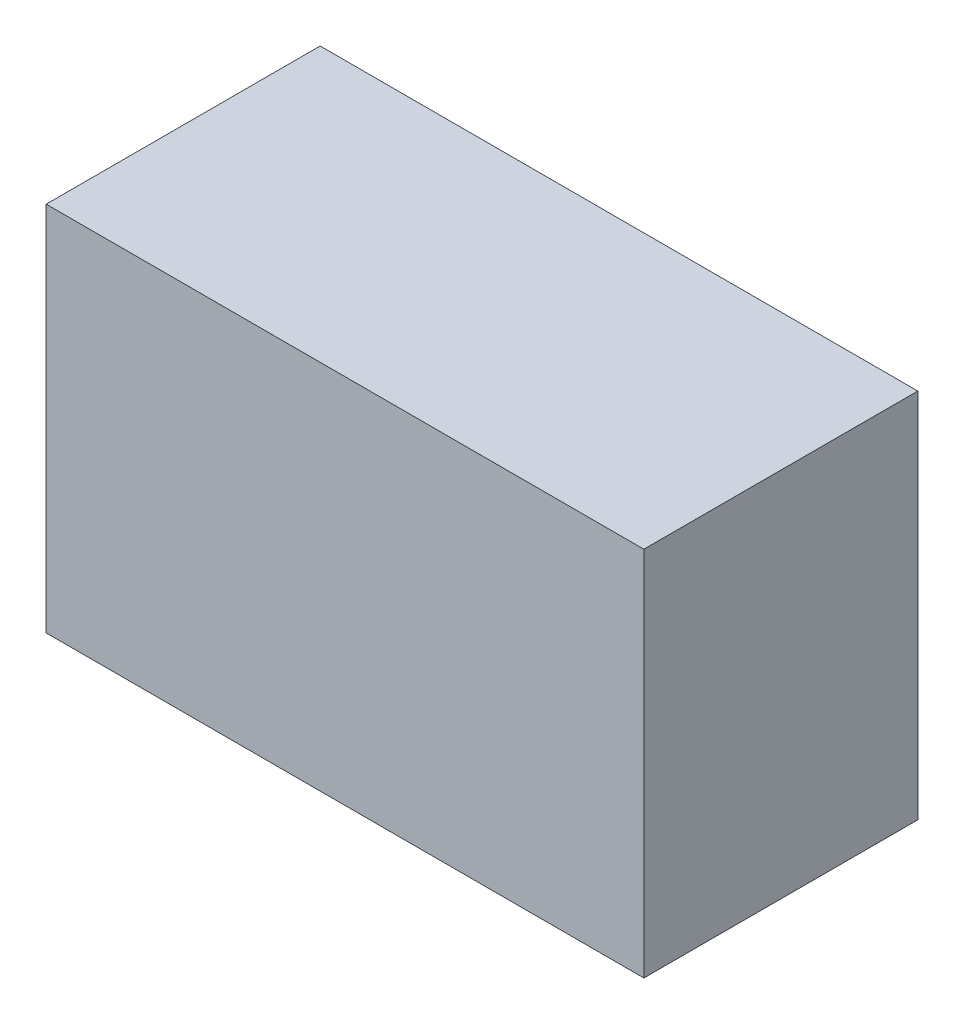
ISO-10303-21;
HEADER;
FILE_DESCRIPTION(('STEP AP214'),'2;1');
FILE_NAME('part.step','',(''),(''),'','','');
FILE_SCHEMA(('AUTOMOTIVE_DESIGN { 1 0 10303 214 1 1 1 1 }'));
ENDSEC;
DATA;
#1=APPLICATION_CONTEXT('core data for automotive mechanical design processes');
#2=APPLICATION_PROTOCOL_DEFINITION('international standard','automotive_design',2000,#1);
#3=PRODUCT_CONTEXT('',#1,'mechanical');
#4=PRODUCT('Part','Part','',(#3));
#5=PRODUCT_RELATED_PRODUCT_CATEGORY('part','',(#4));
#6=PRODUCT_DEFINITION_FORMATION('','',#4);
#7=PRODUCT_DEFINITION_CONTEXT('part definition',#1,'design');
#8=PRODUCT_DEFINITION('design','',#6,#7);
#9=PRODUCT_DEFINITION_SHAPE('','',#8);
#10=(LENGTH_UNIT() NAMED_UNIT(*) SI_UNIT(.MILLI.,.METRE.));
#11=(NAMED_UNIT(*) PLANE_ANGLE_UNIT() SI_UNIT($,.RADIAN.));
#12=(NAMED_UNIT(*) SI_UNIT($,.STERADIAN.) SOLID_ANGLE_UNIT());
#13=UNCERTAINTY_MEASURE_WITH_UNIT(LENGTH_MEASURE(1.E-05),#10,'distance_accuracy_value','');
#14=(GEOMETRIC_REPRESENTATION_CONTEXT(3) GLOBAL_UNCERTAINTY_ASSIGNED_CONTEXT((#13)) GLOBAL_UNIT_ASSIGNED_CONTEXT((#10,
#11,#12)) REPRESENTATION_CONTEXT('',''));
#15=CARTESIAN_POINT('',(0.,0.,0.));
#16=DIRECTION('',(0.,0.,1.));
#17=DIRECTION('',(1.,0.,0.));
#18=AXIS2_PLACEMENT_3D('',#15,#16,#17);
#19=CARTESIAN_POINT('',(0.,53.975,0.));
#20=DIRECTION('',(1.,0.,0.));
#21=DIRECTION('',(0.,0.,-1.));
#22=AXIS2_PLACEMENT_3D('',#19,#20,#21);
#23=PLANE('',#22);
#24=DIRECTION('',(0.,0.,1.));
#25=VECTOR('',#24,1.);
#26=CARTESIAN_POINT('',(0.,0.,0.));
#27=LINE('',#26,#25);
#28=CARTESIAN_POINT('',(0.,0.,-39.8145));
#29=VERTEX_POINT('',#28);
#30=CARTESIAN_POINT('',(0.,0.,0.));
#31=VERTEX_POINT('',#30);
#32=EDGE_CURVE('E111',#29,#31,#27,.T.);
#33=ORIENTED_EDGE('',*,*,#32,.T.);
#34=DIRECTION('',(0.,-1.,0.));
#35=VECTOR('',#34,1.);
#36=CARTESIAN_POINT('',(0.,53.975,0.));
#37=LINE('',#36,#35);
#38=CARTESIAN_POINT('',(0.,53.975,0.));
#39=VERTEX_POINT('',#38);
#40=EDGE_CURVE('E12',#39,#31,#37,.T.);
#41=ORIENTED_EDGE('',*,*,#40,.F.);
#42=DIRECTION('',(0.,0.,1.));
#43=VECTOR('',#42,1.);
#44=CARTESIAN_POINT('',(0.,53.975,0.));
#45=LINE('',#44,#43);
#46=CARTESIAN_POINT('',(0.,53.975,-39.8145));
#47=VERTEX_POINT('',#46);
#48=EDGE_CURVE('E98',#47,#39,#45,.T.);
#49=ORIENTED_EDGE('',*,*,#48,.F.);
#50=DIRECTION('',(0.,-1.,0.));
#51=VECTOR('',#50,1.);
#52=CARTESIAN_POINT('',(0.,53.975,-39.8145));
#53=LINE('',#52,#51);
#54=EDGE_CURVE('E107',#47,#29,#53,.T.);
#55=ORIENTED_EDGE('',*,*,#54,.T.);
#56=EDGE_LOOP('',(#33,#41,#49,#55));
#57=FACE_BOUND('',#56,.T.);
#58=ADVANCED_FACE('F43',(#57),#23,.F.);
#59=CARTESIAN_POINT('',(0.,53.975,0.));
#60=DIRECTION('',(0.,0.,-1.));
#61=DIRECTION('',(-1.,0.,0.));
#62=AXIS2_PLACEMENT_3D('',#59,#60,#61);
#63=PLANE('',#62);
#64=DIRECTION('',(1.,0.,0.));
#65=VECTOR('',#64,1.);
#66=CARTESIAN_POINT('',(0.,0.,0.));
#67=LINE('',#66,#65);
#68=CARTESIAN_POINT('',(86.868,0.,0.));
#69=VERTEX_POINT('',#68);
#70=EDGE_CURVE('E102',#31,#69,#67,.T.);
#71=ORIENTED_EDGE('',*,*,#70,.T.);
#72=DIRECTION('',(0.,-1.,0.));
#73=VECTOR('',#72,1.);
#74=CARTESIAN_POINT('',(86.868,53.975,0.));
#75=LINE('',#74,#73);
#76=CARTESIAN_POINT('',(86.868,53.975,0.));
#77=VERTEX_POINT('',#76);
#78=EDGE_CURVE('E51',#77,#69,#75,.T.);
#79=ORIENTED_EDGE('',*,*,#78,.F.);
#80=DIRECTION('',(1.,0.,0.));
#81=VECTOR('',#80,1.);
#82=CARTESIAN_POINT('',(0.,53.975,0.));
#83=LINE('',#82,#81);
#84=EDGE_CURVE('E93',#39,#77,#83,.T.);
#85=ORIENTED_EDGE('',*,*,#84,.F.);
#86=ORIENTED_EDGE('',*,*,#40,.T.);
#87=EDGE_LOOP('',(#71,#79,#85,#86));
#88=FACE_BOUND('',#87,.T.);
#89=ADVANCED_FACE('F101',(#88),#63,.F.);
#90=CARTESIAN_POINT('',(86.868,53.975,0.));
#91=DIRECTION('',(-1.,0.,0.));
#92=DIRECTION('',(0.,0.,1.));
#93=AXIS2_PLACEMENT_3D('',#90,#91,#92);
#94=PLANE('',#93);
#95=DIRECTION('',(0.,0.,-1.));
#96=VECTOR('',#95,1.);
#97=CARTESIAN_POINT('',(86.868,0.,0.));
#98=LINE('',#97,#96);
#99=CARTESIAN_POINT('',(86.868,0.,-39.8145));
#100=VERTEX_POINT('',#99);
#101=EDGE_CURVE('E78',#69,#100,#98,.T.);
#102=ORIENTED_EDGE('',*,*,#101,.T.);
#103=DIRECTION('',(0.,-1.,0.));
#104=VECTOR('',#103,1.);
#105=CARTESIAN_POINT('',(86.868,53.975,-39.8145));
#106=LINE('',#105,#104);
#107=CARTESIAN_POINT('',(86.868,53.975,-39.8145));
#108=VERTEX_POINT('',#107);
#109=EDGE_CURVE('E103',#108,#100,#106,.T.);
#110=ORIENTED_EDGE('',*,*,#109,.F.);
#111=DIRECTION('',(0.,0.,-1.));
#112=VECTOR('',#111,1.);
#113=CARTESIAN_POINT('',(86.868,53.975,0.));
#114=LINE('',#113,#112);
#115=EDGE_CURVE('E96',#77,#108,#114,.T.);
#116=ORIENTED_EDGE('',*,*,#115,.F.);
#117=ORIENTED_EDGE('',*,*,#78,.T.);
#118=EDGE_LOOP('',(#102,#110,#116,#117));
#119=FACE_BOUND('',#118,.T.);
#120=ADVANCED_FACE('F104',(#119),#94,.F.);
#121=CARTESIAN_POINT('',(0.,53.975,-39.8145));
#122=DIRECTION('',(0.,0.,1.));
#123=DIRECTION('',(1.,0.,0.));
#124=AXIS2_PLACEMENT_3D('',#121,#122,#123);
#125=PLANE('',#124);
#126=DIRECTION('',(-1.,0.,0.));
#127=VECTOR('',#126,1.);
#128=CARTESIAN_POINT('',(0.,0.,-39.8145));
#129=LINE('',#128,#127);
#130=EDGE_CURVE('E86',#100,#29,#129,.T.);
#131=ORIENTED_EDGE('',*,*,#130,.T.);
#132=ORIENTED_EDGE('',*,*,#54,.F.);
#133=DIRECTION('',(-1.,0.,0.));
#134=VECTOR('',#133,1.);
#135=CARTESIAN_POINT('',(0.,53.975,-39.8145));
#136=LINE('',#135,#134);
#137=EDGE_CURVE('E61',#108,#47,#136,.T.);
#138=ORIENTED_EDGE('',*,*,#137,.F.);
#139=ORIENTED_EDGE('',*,*,#109,.T.);
#140=EDGE_LOOP('',(#131,#132,#138,#139));
#141=FACE_BOUND('',#140,.T.);
#142=ADVANCED_FACE('F118',(#141),#125,.F.);
#143=CARTESIAN_POINT('',(0.,53.975,0.));
#144=DIRECTION('',(0.,-1.,0.));
#145=DIRECTION('',(0.,0.,-1.));
#146=AXIS2_PLACEMENT_3D('',#143,#144,#145);
#147=PLANE('',#146);
#148=ORIENTED_EDGE('',*,*,#48,.T.);
#149=ORIENTED_EDGE('',*,*,#84,.T.);
#150=ORIENTED_EDGE('',*,*,#115,.T.);
#151=ORIENTED_EDGE('',*,*,#137,.T.);
#152=EDGE_LOOP('',(#148,#149,#150,#151));
#153=FACE_BOUND('',#152,.T.);
#154=ADVANCED_FACE('F94',(#153),#147,.F.);
#155=CARTESIAN_POINT('',(0.,0.,0.));
#156=DIRECTION('',(0.,-1.,0.));
#157=DIRECTION('',(0.,0.,-1.));
#158=AXIS2_PLACEMENT_3D('',#155,#156,#157);
#159=PLANE('',#158);
#160=ORIENTED_EDGE('',*,*,#32,.F.);
#161=ORIENTED_EDGE('',*,*,#130,.F.);
#162=ORIENTED_EDGE('',*,*,#101,.F.);
#163=ORIENTED_EDGE('',*,*,#70,.F.);
#164=EDGE_LOOP('',(#160,#161,#162,#163));
#165=FACE_BOUND('',#164,.T.);
#166=ADVANCED_FACE('F121',(#165),#159,.T.);
#167=CLOSED_SHELL('',(#58,#89,#120,#142,#154,#166));
#168=MANIFOLD_SOLID_BREP('B2',#167);
#169=ADVANCED_BREP_SHAPE_REPRESENTATION('',(#18,#168),#14);
#170=SHAPE_DEFINITION_REPRESENTATION(#9,#169);
ENDSEC;
END-ISO-10303-21;
